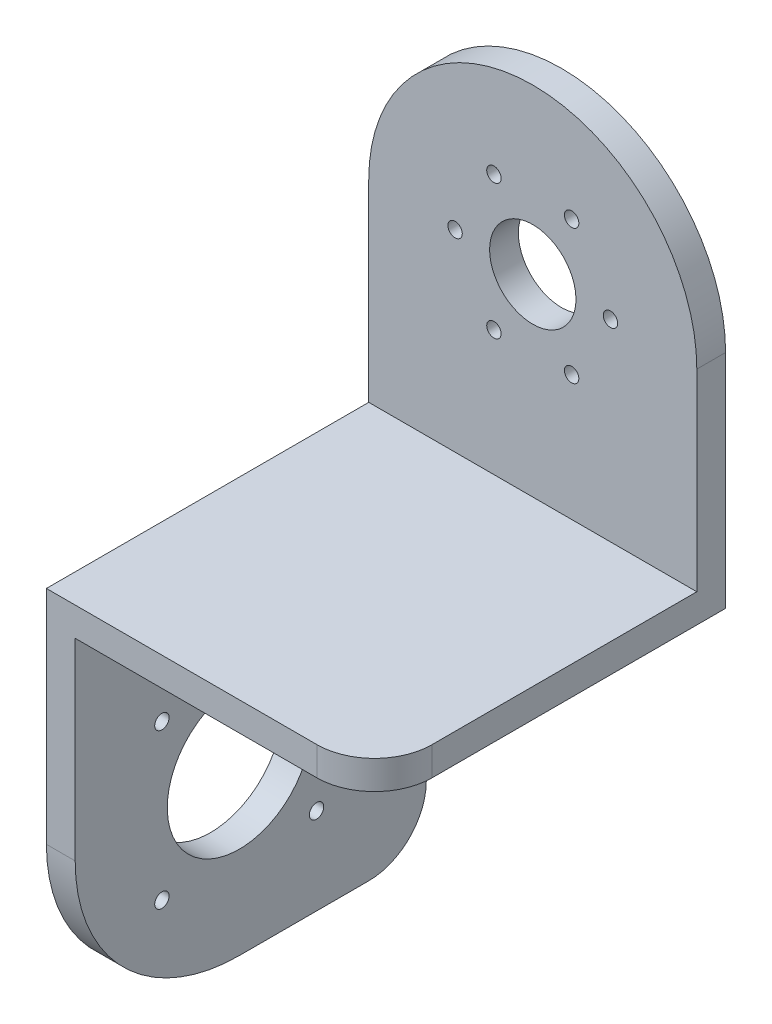
ISO-10303-21;
HEADER;
FILE_DESCRIPTION(('STEP AP214'),'2;1');
FILE_NAME('part.step','',(''),(''),'','','');
FILE_SCHEMA(('AUTOMOTIVE_DESIGN { 1 0 10303 214 1 1 1 1 }'));
ENDSEC;
DATA;
#1=APPLICATION_CONTEXT('core data for automotive mechanical design processes');
#2=APPLICATION_PROTOCOL_DEFINITION('international standard','automotive_design',2000,#1);
#3=PRODUCT_CONTEXT('',#1,'mechanical');
#4=PRODUCT('Part','Part','',(#3));
#5=PRODUCT_RELATED_PRODUCT_CATEGORY('part','',(#4));
#6=PRODUCT_DEFINITION_FORMATION('','',#4);
#7=PRODUCT_DEFINITION_CONTEXT('part definition',#1,'design');
#8=PRODUCT_DEFINITION('design','',#6,#7);
#9=PRODUCT_DEFINITION_SHAPE('','',#8);
#10=(LENGTH_UNIT() NAMED_UNIT(*) SI_UNIT(.MILLI.,.METRE.));
#11=(NAMED_UNIT(*) PLANE_ANGLE_UNIT() SI_UNIT($,.RADIAN.));
#12=(NAMED_UNIT(*) SI_UNIT($,.STERADIAN.) SOLID_ANGLE_UNIT());
#13=UNCERTAINTY_MEASURE_WITH_UNIT(LENGTH_MEASURE(1.E-05),#10,'distance_accuracy_value','');
#14=(GEOMETRIC_REPRESENTATION_CONTEXT(3) GLOBAL_UNCERTAINTY_ASSIGNED_CONTEXT((#13)) GLOBAL_UNIT_ASSIGNED_CONTEXT((#10,
#11,#12)) REPRESENTATION_CONTEXT('',''));
#15=CARTESIAN_POINT('',(0.,0.,0.));
#16=DIRECTION('',(0.,0.,1.));
#17=DIRECTION('',(1.,0.,0.));
#18=AXIS2_PLACEMENT_3D('',#15,#16,#17);
#19=CARTESIAN_POINT('',(0.,-10.1572899751787,61.));
#20=DIRECTION('',(1.,0.,0.));
#21=DIRECTION('',(0.,0.,-1.));
#22=AXIS2_PLACEMENT_3D('',#19,#20,#21);
#23=PLANE('',#22);
#24=CARTESIAN_POINT('',(0.,-25.0649711574557,19.0649711574555));
#25=DIRECTION('',(1.,0.,0.));
#26=DIRECTION('',(0.,0.,-1.));
#27=AXIS2_PLACEMENT_3D('',#24,#25,#26);
#28=CIRCLE('',#27,1.25);
#29=CARTESIAN_POINT('',(0.,-25.0649711574557,17.8149711574555));
#30=VERTEX_POINT('',#29);
#31=EDGE_CURVE('E245',#30,#30,#28,.T.);
#32=ORIENTED_EDGE('',*,*,#31,.T.);
#33=EDGE_LOOP('',(#32));
#34=FACE_BOUND('',#33,.T.);
#35=CARTESIAN_POINT('',(0.,-51.9350288425444,19.0649711574556));
#36=DIRECTION('',(1.,0.,0.));
#37=DIRECTION('',(0.,0.,-1.));
#38=AXIS2_PLACEMENT_3D('',#35,#36,#37);
#39=CIRCLE('',#38,1.25);
#40=CARTESIAN_POINT('',(0.,-51.9350288425444,17.8149711574556));
#41=VERTEX_POINT('',#40);
#42=EDGE_CURVE('E334',#41,#41,#39,.T.);
#43=ORIENTED_EDGE('',*,*,#42,.T.);
#44=EDGE_LOOP('',(#43));
#45=FACE_BOUND('',#44,.T.);
#46=CARTESIAN_POINT('',(0.,-25.0649711574557,45.9350288425445));
#47=DIRECTION('',(1.,0.,0.));
#48=DIRECTION('',(0.,0.,-1.));
#49=AXIS2_PLACEMENT_3D('',#46,#47,#48);
#50=CIRCLE('',#49,1.25);
#51=CARTESIAN_POINT('',(0.,-25.0649711574557,44.6850288425445));
#52=VERTEX_POINT('',#51);
#53=EDGE_CURVE('E389',#52,#52,#50,.T.);
#54=ORIENTED_EDGE('',*,*,#53,.T.);
#55=EDGE_LOOP('',(#54));
#56=FACE_BOUND('',#55,.T.);
#57=CARTESIAN_POINT('',(0.,-51.9350288425443,45.9350288425445));
#58=DIRECTION('',(1.,0.,0.));
#59=DIRECTION('',(0.,0.,-1.));
#60=AXIS2_PLACEMENT_3D('',#57,#58,#59);
#61=CIRCLE('',#60,1.25);
#62=CARTESIAN_POINT('',(0.,-51.9350288425443,44.6850288425445));
#63=VERTEX_POINT('',#62);
#64=EDGE_CURVE('E147',#63,#63,#61,.T.);
#65=ORIENTED_EDGE('',*,*,#64,.T.);
#66=EDGE_LOOP('',(#65));
#67=FACE_BOUND('',#66,.T.);
#68=CARTESIAN_POINT('',(0.,-38.5,32.5));
#69=DIRECTION('',(1.,0.,0.));
#70=DIRECTION('',(0.,0.,-1.));
#71=AXIS2_PLACEMENT_3D('',#68,#69,#70);
#72=CIRCLE('',#71,12.5);
#73=CARTESIAN_POINT('',(0.,-38.5,20.));
#74=VERTEX_POINT('',#73);
#75=EDGE_CURVE('E231',#74,#74,#72,.T.);
#76=ORIENTED_EDGE('',*,*,#75,.T.);
#77=EDGE_LOOP('',(#76));
#78=FACE_BOUND('',#77,.T.);
#79=DIRECTION('',(0.,-1.,0.));
#80=VECTOR('',#79,1.);
#81=CARTESIAN_POINT('',(0.,-10.1572899751787,0.));
#82=LINE('',#81,#80);
#83=CARTESIAN_POINT('',(0.,33.5,0.));
#84=VERTEX_POINT('',#83);
#85=CARTESIAN_POINT('',(0.,-57.,0.));
#86=VERTEX_POINT('',#85);
#87=EDGE_CURVE('E257',#84,#86,#82,.T.);
#88=ORIENTED_EDGE('',*,*,#87,.T.);
#89=CARTESIAN_POINT('',(0.,-57.,10.));
#90=DIRECTION('',(1.,0.,0.));
#91=DIRECTION('',(0.,0.,-1.));
#92=AXIS2_PLACEMENT_3D('',#89,#90,#91);
#93=CIRCLE('',#92,10.);
#94=CARTESIAN_POINT('',(0.,-67.,10.));
#95=VERTEX_POINT('',#94);
#96=EDGE_CURVE('E11',#86,#95,#93,.F.);
#97=ORIENTED_EDGE('',*,*,#96,.T.);
#98=DIRECTION('',(0.,0.,-1.));
#99=VECTOR('',#98,1.);
#100=CARTESIAN_POINT('',(0.,-67.,61.));
#101=LINE('',#100,#99);
#102=CARTESIAN_POINT('',(0.,-67.,32.5));
#103=VERTEX_POINT('',#102);
#104=EDGE_CURVE('E154',#103,#95,#101,.T.);
#105=ORIENTED_EDGE('',*,*,#104,.F.);
#106=CARTESIAN_POINT('',(0.,-38.5,32.5));
#107=DIRECTION('',(1.,0.,0.));
#108=DIRECTION('',(0.,0.,-1.));
#109=AXIS2_PLACEMENT_3D('',#106,#107,#108);
#110=CIRCLE('',#109,28.5);
#111=CARTESIAN_POINT('',(0.,-38.5,61.));
#112=VERTEX_POINT('',#111);
#113=EDGE_CURVE('E134',#112,#103,#110,.T.);
#114=ORIENTED_EDGE('',*,*,#113,.F.);
#115=DIRECTION('',(0.,-1.,0.));
#116=VECTOR('',#115,1.);
#117=CARTESIAN_POINT('',(0.,-10.1572899751787,61.));
#118=LINE('',#117,#116);
#119=CARTESIAN_POINT('',(0.,0.,61.));
#120=VERTEX_POINT('',#119);
#121=EDGE_CURVE('E355',#120,#112,#118,.T.);
#122=ORIENTED_EDGE('',*,*,#121,.F.);
#123=DIRECTION('',(0.,0.,-1.));
#124=VECTOR('',#123,1.);
#125=CARTESIAN_POINT('',(0.,0.,61.));
#126=LINE('',#125,#124);
#127=CARTESIAN_POINT('',(0.,0.,5.00000000000002));
#128=VERTEX_POINT('',#127);
#129=EDGE_CURVE('E328',#120,#128,#126,.T.);
#130=ORIENTED_EDGE('',*,*,#129,.T.);
#131=DIRECTION('',(0.,1.,0.));
#132=VECTOR('',#131,1.);
#133=CARTESIAN_POINT('',(0.,62.,5.));
#134=LINE('',#133,#132);
#135=CARTESIAN_POINT('',(0.,33.5,5.));
#136=VERTEX_POINT('',#135);
#137=EDGE_CURVE('E343',#128,#136,#134,.T.);
#138=ORIENTED_EDGE('',*,*,#137,.T.);
#139=DIRECTION('',(0.,0.,-1.));
#140=VECTOR('',#139,1.);
#141=CARTESIAN_POINT('',(0.,33.5,10.));
#142=LINE('',#141,#140);
#143=EDGE_CURVE('E171',#136,#84,#142,.T.);
#144=ORIENTED_EDGE('',*,*,#143,.T.);
#145=EDGE_LOOP('',(#88,#97,#105,#114,#122,#130,#138,#144));
#146=FACE_BOUND('',#145,.T.);
#147=ADVANCED_FACE('F46',(#34,#45,#56,#67,#78,#146),#23,.F.);
#148=CARTESIAN_POINT('',(0.,-67.,61.));
#149=DIRECTION('',(0.,1.,0.));
#150=DIRECTION('',(0.,0.,1.));
#151=AXIS2_PLACEMENT_3D('',#148,#149,#150);
#152=PLANE('',#151);
#153=ORIENTED_EDGE('',*,*,#104,.T.);
#154=DIRECTION('',(1.,0.,0.));
#155=VECTOR('',#154,1.);
#156=CARTESIAN_POINT('',(5.00000000000001,-67.,10.));
#157=LINE('',#156,#155);
#158=CARTESIAN_POINT('',(5.00000000000001,-67.,10.));
#159=VERTEX_POINT('',#158);
#160=EDGE_CURVE('E152',#95,#159,#157,.T.);
#161=ORIENTED_EDGE('',*,*,#160,.T.);
#162=DIRECTION('',(0.,0.,-1.));
#163=VECTOR('',#162,1.);
#164=CARTESIAN_POINT('',(5.00000000000001,-67.,61.));
#165=LINE('',#164,#163);
#166=CARTESIAN_POINT('',(5.00000000000001,-67.,32.5));
#167=VERTEX_POINT('',#166);
#168=EDGE_CURVE('E143',#167,#159,#165,.T.);
#169=ORIENTED_EDGE('',*,*,#168,.F.);
#170=DIRECTION('',(1.,0.,0.));
#171=VECTOR('',#170,1.);
#172=CARTESIAN_POINT('',(-4.99999999999999,-67.,32.5));
#173=LINE('',#172,#171);
#174=EDGE_CURVE('E128',#103,#167,#173,.T.);
#175=ORIENTED_EDGE('',*,*,#174,.F.);
#176=EDGE_LOOP('',(#153,#161,#169,#175));
#177=FACE_BOUND('',#176,.T.);
#178=ADVANCED_FACE('F150',(#177),#152,.F.);
#179=CARTESIAN_POINT('',(5.00000000000001,-67.,61.));
#180=DIRECTION('',(-1.,0.,0.));
#181=DIRECTION('',(0.,-1.,0.));
#182=AXIS2_PLACEMENT_3D('',#179,#180,#181);
#183=PLANE('',#182);
#184=CARTESIAN_POINT('',(5.00000000000001,-25.0649711574557,19.0649711574555));
#185=DIRECTION('',(1.,0.,0.));
#186=DIRECTION('',(0.,-1.,0.));
#187=AXIS2_PLACEMENT_3D('',#184,#185,#186);
#188=CIRCLE('',#187,1.25);
#189=CARTESIAN_POINT('',(5.00000000000001,-26.3149711574557,19.0649711574555));
#190=VERTEX_POINT('',#189);
#191=EDGE_CURVE('E305',#190,#190,#188,.T.);
#192=ORIENTED_EDGE('',*,*,#191,.F.);
#193=EDGE_LOOP('',(#192));
#194=FACE_BOUND('',#193,.T.);
#195=CARTESIAN_POINT('',(5.00000000000001,-51.9350288425444,19.0649711574556));
#196=DIRECTION('',(1.,0.,0.));
#197=DIRECTION('',(0.,0.,1.));
#198=AXIS2_PLACEMENT_3D('',#195,#196,#197);
#199=CIRCLE('',#198,1.25);
#200=CARTESIAN_POINT('',(5.00000000000001,-51.9350288425444,20.3149711574556));
#201=VERTEX_POINT('',#200);
#202=EDGE_CURVE('E314',#201,#201,#199,.T.);
#203=ORIENTED_EDGE('',*,*,#202,.F.);
#204=EDGE_LOOP('',(#203));
#205=FACE_BOUND('',#204,.T.);
#206=CARTESIAN_POINT('',(5.00000000000001,-25.0649711574557,45.9350288425445));
#207=DIRECTION('',(1.,0.,0.));
#208=DIRECTION('',(0.,0.,-1.));
#209=AXIS2_PLACEMENT_3D('',#206,#207,#208);
#210=CIRCLE('',#209,1.25);
#211=CARTESIAN_POINT('',(5.00000000000001,-25.0649711574557,44.6850288425445));
#212=VERTEX_POINT('',#211);
#213=EDGE_CURVE('E302',#212,#212,#210,.T.);
#214=ORIENTED_EDGE('',*,*,#213,.F.);
#215=EDGE_LOOP('',(#214));
#216=FACE_BOUND('',#215,.T.);
#217=CARTESIAN_POINT('',(5.00000000000001,-51.9350288425443,45.9350288425445));
#218=DIRECTION('',(1.,0.,0.));
#219=DIRECTION('',(0.,1.,0.));
#220=AXIS2_PLACEMENT_3D('',#217,#218,#219);
#221=CIRCLE('',#220,1.25);
#222=CARTESIAN_POINT('',(5.00000000000001,-50.6850288425443,45.9350288425445));
#223=VERTEX_POINT('',#222);
#224=EDGE_CURVE('E240',#223,#223,#221,.T.);
#225=ORIENTED_EDGE('',*,*,#224,.F.);
#226=EDGE_LOOP('',(#225));
#227=FACE_BOUND('',#226,.T.);
#228=CARTESIAN_POINT('',(5.00000000000001,-38.5,32.5));
#229=DIRECTION('',(1.,0.,0.));
#230=DIRECTION('',(0.,1.,0.));
#231=AXIS2_PLACEMENT_3D('',#228,#229,#230);
#232=CIRCLE('',#231,12.5);
#233=CARTESIAN_POINT('',(5.00000000000001,-26.,32.5));
#234=VERTEX_POINT('',#233);
#235=EDGE_CURVE('E244',#234,#234,#232,.T.);
#236=ORIENTED_EDGE('',*,*,#235,.F.);
#237=EDGE_LOOP('',(#236));
#238=FACE_BOUND('',#237,.T.);
#239=ORIENTED_EDGE('',*,*,#168,.T.);
#240=CARTESIAN_POINT('',(5.00000000000001,-57.,10.));
#241=DIRECTION('',(-1.,0.,0.));
#242=DIRECTION('',(0.,-1.,0.));
#243=AXIS2_PLACEMENT_3D('',#240,#241,#242);
#244=CIRCLE('',#243,10.);
#245=CARTESIAN_POINT('',(5.00000000000001,-57.,0.));
#246=VERTEX_POINT('',#245);
#247=EDGE_CURVE('E69',#159,#246,#244,.F.);
#248=ORIENTED_EDGE('',*,*,#247,.T.);
#249=DIRECTION('',(0.,1.,0.));
#250=VECTOR('',#249,1.);
#251=CARTESIAN_POINT('',(5.00000000000001,-67.,0.));
#252=LINE('',#251,#250);
#253=CARTESIAN_POINT('',(5.,-5.00000000000001,0.));
#254=VERTEX_POINT('',#253);
#255=EDGE_CURVE('E360',#246,#254,#252,.T.);
#256=ORIENTED_EDGE('',*,*,#255,.T.);
#257=DIRECTION('',(0.,0.,-1.));
#258=VECTOR('',#257,1.);
#259=CARTESIAN_POINT('',(5.,-5.00000000000001,61.));
#260=LINE('',#259,#258);
#261=CARTESIAN_POINT('',(5.,-5.00000000000001,61.));
#262=VERTEX_POINT('',#261);
#263=EDGE_CURVE('E155',#262,#254,#260,.T.);
#264=ORIENTED_EDGE('',*,*,#263,.F.);
#265=DIRECTION('',(0.,1.,0.));
#266=VECTOR('',#265,1.);
#267=CARTESIAN_POINT('',(5.00000000000001,-67.,61.));
#268=LINE('',#267,#266);
#269=CARTESIAN_POINT('',(5.00000000000001,-38.5,61.));
#270=VERTEX_POINT('',#269);
#271=EDGE_CURVE('E145',#270,#262,#268,.T.);
#272=ORIENTED_EDGE('',*,*,#271,.F.);
#273=CARTESIAN_POINT('',(5.00000000000001,-38.5,32.5));
#274=DIRECTION('',(1.,0.,0.));
#275=DIRECTION('',(0.,1.,0.));
#276=AXIS2_PLACEMENT_3D('',#273,#274,#275);
#277=CIRCLE('',#276,28.5);
#278=EDGE_CURVE('E131',#270,#167,#277,.T.);
#279=ORIENTED_EDGE('',*,*,#278,.T.);
#280=EDGE_LOOP('',(#239,#248,#256,#264,#272,#279));
#281=FACE_BOUND('',#280,.T.);
#282=ADVANCED_FACE('F142',(#194,#205,#216,#227,#238,#281),#183,.F.);
#283=CARTESIAN_POINT('',(0.,0.,0.));
#284=DIRECTION('',(0.,0.,-1.));
#285=DIRECTION('',(-1.,0.,0.));
#286=AXIS2_PLACEMENT_3D('',#283,#284,#285);
#287=PLANE('',#286);
#288=CARTESIAN_POINT('',(42.,33.5,0.));
#289=DIRECTION('',(0.,0.,-1.));
#290=DIRECTION('',(1.,0.,0.));
#291=AXIS2_PLACEMENT_3D('',#288,#289,#290);
#292=CIRCLE('',#291,1.25);
#293=CARTESIAN_POINT('',(43.25,33.5,0.));
#294=VERTEX_POINT('',#293);
#295=EDGE_CURVE('E290',#294,#294,#292,.T.);
#296=ORIENTED_EDGE('',*,*,#295,.F.);
#297=EDGE_LOOP('',(#296));
#298=FACE_BOUND('',#297,.T.);
#299=CARTESIAN_POINT('',(35.2499999999999,21.80865704891,0.));
#300=DIRECTION('',(0.,0.,-1.));
#301=DIRECTION('',(0.499999999999992,-0.866025403784443,0.));
#302=AXIS2_PLACEMENT_3D('',#299,#300,#301);
#303=CIRCLE('',#302,1.25);
#304=CARTESIAN_POINT('',(35.8749999999999,20.7261252941795,0.));
#305=VERTEX_POINT('',#304);
#306=EDGE_CURVE('E284',#305,#305,#303,.T.);
#307=ORIENTED_EDGE('',*,*,#306,.F.);
#308=EDGE_LOOP('',(#307));
#309=FACE_BOUND('',#308,.T.);
#310=CARTESIAN_POINT('',(21.75,45.1913429510899,0.));
#311=DIRECTION('',(0.,0.,-1.));
#312=DIRECTION('',(-0.499999999999998,0.86602540378444,0.));
#313=AXIS2_PLACEMENT_3D('',#310,#311,#312);
#314=CIRCLE('',#313,1.25);
#315=CARTESIAN_POINT('',(21.125,46.2738747058205,0.));
#316=VERTEX_POINT('',#315);
#317=EDGE_CURVE('E191',#316,#316,#314,.T.);
#318=ORIENTED_EDGE('',*,*,#317,.F.);
#319=EDGE_LOOP('',(#318));
#320=FACE_BOUND('',#319,.T.);
#321=CARTESIAN_POINT('',(35.2500000000001,45.1913429510899,0.));
#322=DIRECTION('',(0.,0.,-1.));
#323=DIRECTION('',(0.500000000000004,0.866025403784436,0.));
#324=AXIS2_PLACEMENT_3D('',#321,#322,#323);
#325=CIRCLE('',#324,1.25);
#326=CARTESIAN_POINT('',(35.8750000000001,46.2738747058204,0.));
#327=VERTEX_POINT('',#326);
#328=EDGE_CURVE('E271',#327,#327,#325,.T.);
#329=ORIENTED_EDGE('',*,*,#328,.F.);
#330=EDGE_LOOP('',(#329));
#331=FACE_BOUND('',#330,.T.);
#332=CARTESIAN_POINT('',(21.7499999999999,21.8086570489102,0.));
#333=DIRECTION('',(0.,0.,-1.));
#334=DIRECTION('',(-0.50000000000001,-0.866025403784433,0.));
#335=AXIS2_PLACEMENT_3D('',#332,#333,#334);
#336=CIRCLE('',#335,1.25);
#337=CARTESIAN_POINT('',(21.1249999999999,20.7261252941796,0.));
#338=VERTEX_POINT('',#337);
#339=EDGE_CURVE('E251',#338,#338,#336,.T.);
#340=ORIENTED_EDGE('',*,*,#339,.F.);
#341=EDGE_LOOP('',(#340));
#342=FACE_BOUND('',#341,.T.);
#343=CARTESIAN_POINT('',(28.5,33.4999999999999,0.));
#344=DIRECTION('',(0.,0.,-1.));
#345=DIRECTION('',(-1.,0.,0.));
#346=AXIS2_PLACEMENT_3D('',#343,#344,#345);
#347=CIRCLE('',#346,7.5);
#348=CARTESIAN_POINT('',(21.,33.4999999999999,0.));
#349=VERTEX_POINT('',#348);
#350=EDGE_CURVE('E181',#349,#349,#347,.T.);
#351=ORIENTED_EDGE('',*,*,#350,.F.);
#352=EDGE_LOOP('',(#351));
#353=FACE_BOUND('',#352,.T.);
#354=CARTESIAN_POINT('',(15.,33.5,0.));
#355=DIRECTION('',(0.,0.,-1.));
#356=DIRECTION('',(-1.,0.,0.));
#357=AXIS2_PLACEMENT_3D('',#354,#355,#356);
#358=CIRCLE('',#357,1.25);
#359=CARTESIAN_POINT('',(13.75,33.5,0.));
#360=VERTEX_POINT('',#359);
#361=EDGE_CURVE('E207',#360,#360,#358,.T.);
#362=ORIENTED_EDGE('',*,*,#361,.F.);
#363=EDGE_LOOP('',(#362));
#364=FACE_BOUND('',#363,.T.);
#365=ORIENTED_EDGE('',*,*,#255,.F.);
#366=DIRECTION('',(1.,0.,0.));
#367=VECTOR('',#366,1.);
#368=CARTESIAN_POINT('',(0.,-57.,0.));
#369=LINE('',#368,#367);
#370=EDGE_CURVE('E55',#246,#86,#369,.F.);
#371=ORIENTED_EDGE('',*,*,#370,.T.);
#372=ORIENTED_EDGE('',*,*,#87,.F.);
#373=CARTESIAN_POINT('',(28.5,33.5,0.));
#374=DIRECTION('',(0.,0.,-1.));
#375=DIRECTION('',(-1.,0.,0.));
#376=AXIS2_PLACEMENT_3D('',#373,#374,#375);
#377=CIRCLE('',#376,28.5);
#378=CARTESIAN_POINT('',(57.,33.5,0.));
#379=VERTEX_POINT('',#378);
#380=EDGE_CURVE('E185',#84,#379,#377,.T.);
#381=ORIENTED_EDGE('',*,*,#380,.T.);
#382=DIRECTION('',(0.,1.,0.));
#383=VECTOR('',#382,1.);
#384=CARTESIAN_POINT('',(57.,0.,0.));
#385=LINE('',#384,#383);
#386=CARTESIAN_POINT('',(57.,-5.,0.));
#387=VERTEX_POINT('',#386);
#388=EDGE_CURVE('E351',#387,#379,#385,.T.);
#389=ORIENTED_EDGE('',*,*,#388,.F.);
#390=DIRECTION('',(1.,0.,0.));
#391=VECTOR('',#390,1.);
#392=CARTESIAN_POINT('',(57.,-5.,0.));
#393=LINE('',#392,#391);
#394=EDGE_CURVE('E356',#254,#387,#393,.T.);
#395=ORIENTED_EDGE('',*,*,#394,.F.);
#396=EDGE_LOOP('',(#365,#371,#372,#381,#389,#395));
#397=FACE_BOUND('',#396,.T.);
#398=ADVANCED_FACE('F401',(#298,#309,#320,#331,#342,#353,#364,#397),#287,.T.);
#399=CARTESIAN_POINT('',(57.,62.,5.));
#400=DIRECTION('',(0.,0.,1.));
#401=DIRECTION('',(0.,-1.,0.));
#402=AXIS2_PLACEMENT_3D('',#399,#400,#401);
#403=PLANE('',#402);
#404=CARTESIAN_POINT('',(42.,33.5,5.));
#405=DIRECTION('',(0.,0.,1.));
#406=DIRECTION('',(0.,-1.,0.));
#407=AXIS2_PLACEMENT_3D('',#404,#405,#406);
#408=CIRCLE('',#407,1.25);
#409=CARTESIAN_POINT('',(42.,32.25,5.));
#410=VERTEX_POINT('',#409);
#411=EDGE_CURVE('E203',#410,#410,#408,.T.);
#412=ORIENTED_EDGE('',*,*,#411,.F.);
#413=EDGE_LOOP('',(#412));
#414=FACE_BOUND('',#413,.T.);
#415=CARTESIAN_POINT('',(35.2499999999999,21.80865704891,5.));
#416=DIRECTION('',(0.,0.,1.));
#417=DIRECTION('',(0.,-1.,0.));
#418=AXIS2_PLACEMENT_3D('',#415,#416,#417);
#419=CIRCLE('',#418,1.25);
#420=CARTESIAN_POINT('',(35.2499999999999,20.55865704891,5.));
#421=VERTEX_POINT('',#420);
#422=EDGE_CURVE('E199',#421,#421,#419,.T.);
#423=ORIENTED_EDGE('',*,*,#422,.F.);
#424=EDGE_LOOP('',(#423));
#425=FACE_BOUND('',#424,.T.);
#426=CARTESIAN_POINT('',(21.75,45.1913429510899,5.));
#427=DIRECTION('',(0.,0.,1.));
#428=DIRECTION('',(0.,-1.,0.));
#429=AXIS2_PLACEMENT_3D('',#426,#427,#428);
#430=CIRCLE('',#429,1.25);
#431=CARTESIAN_POINT('',(21.75,43.9413429510899,5.));
#432=VERTEX_POINT('',#431);
#433=EDGE_CURVE('E195',#432,#432,#430,.T.);
#434=ORIENTED_EDGE('',*,*,#433,.F.);
#435=EDGE_LOOP('',(#434));
#436=FACE_BOUND('',#435,.T.);
#437=CARTESIAN_POINT('',(35.2500000000001,45.1913429510899,5.));
#438=DIRECTION('',(0.,0.,1.));
#439=DIRECTION('',(0.,-1.,0.));
#440=AXIS2_PLACEMENT_3D('',#437,#438,#439);
#441=CIRCLE('',#440,1.25);
#442=CARTESIAN_POINT('',(35.2500000000001,43.9413429510899,5.));
#443=VERTEX_POINT('',#442);
#444=EDGE_CURVE('E190',#443,#443,#441,.T.);
#445=ORIENTED_EDGE('',*,*,#444,.F.);
#446=EDGE_LOOP('',(#445));
#447=FACE_BOUND('',#446,.T.);
#448=CARTESIAN_POINT('',(21.7499999999999,21.8086570489102,5.));
#449=DIRECTION('',(0.,0.,1.));
#450=DIRECTION('',(0.,-1.,0.));
#451=AXIS2_PLACEMENT_3D('',#448,#449,#450);
#452=CIRCLE('',#451,1.25);
#453=CARTESIAN_POINT('',(21.7499999999999,20.5586570489102,5.));
#454=VERTEX_POINT('',#453);
#455=EDGE_CURVE('E186',#454,#454,#452,.T.);
#456=ORIENTED_EDGE('',*,*,#455,.F.);
#457=EDGE_LOOP('',(#456));
#458=FACE_BOUND('',#457,.T.);
#459=CARTESIAN_POINT('',(28.5,33.4999999999999,5.));
#460=DIRECTION('',(0.,0.,1.));
#461=DIRECTION('',(0.,-1.,0.));
#462=AXIS2_PLACEMENT_3D('',#459,#460,#461);
#463=CIRCLE('',#462,7.5);
#464=CARTESIAN_POINT('',(28.5,25.9999999999999,5.));
#465=VERTEX_POINT('',#464);
#466=EDGE_CURVE('E180',#465,#465,#463,.T.);
#467=ORIENTED_EDGE('',*,*,#466,.F.);
#468=EDGE_LOOP('',(#467));
#469=FACE_BOUND('',#468,.T.);
#470=CARTESIAN_POINT('',(15.,33.5,5.));
#471=DIRECTION('',(0.,0.,1.));
#472=DIRECTION('',(0.,-1.,0.));
#473=AXIS2_PLACEMENT_3D('',#470,#471,#472);
#474=CIRCLE('',#473,1.25);
#475=CARTESIAN_POINT('',(15.,32.25,5.));
#476=VERTEX_POINT('',#475);
#477=EDGE_CURVE('E176',#476,#476,#474,.T.);
#478=ORIENTED_EDGE('',*,*,#477,.F.);
#479=EDGE_LOOP('',(#478));
#480=FACE_BOUND('',#479,.T.);
#481=CARTESIAN_POINT('',(28.5,33.5,5.));
#482=DIRECTION('',(0.,0.,1.));
#483=DIRECTION('',(0.,-1.,0.));
#484=AXIS2_PLACEMENT_3D('',#481,#482,#483);
#485=CIRCLE('',#484,28.5);
#486=CARTESIAN_POINT('',(57.,33.5,5.));
#487=VERTEX_POINT('',#486);
#488=EDGE_CURVE('E161',#487,#136,#485,.T.);
#489=ORIENTED_EDGE('',*,*,#488,.T.);
#490=ORIENTED_EDGE('',*,*,#137,.F.);
#491=DIRECTION('',(-1.,0.,0.));
#492=VECTOR('',#491,1.);
#493=CARTESIAN_POINT('',(57.,0.,5.));
#494=LINE('',#493,#492);
#495=CARTESIAN_POINT('',(57.,0.,5.));
#496=VERTEX_POINT('',#495);
#497=EDGE_CURVE('E254',#496,#128,#494,.T.);
#498=ORIENTED_EDGE('',*,*,#497,.F.);
#499=DIRECTION('',(0.,1.,0.));
#500=VECTOR('',#499,1.);
#501=CARTESIAN_POINT('',(57.,62.,5.));
#502=LINE('',#501,#500);
#503=EDGE_CURVE('E258',#496,#487,#502,.T.);
#504=ORIENTED_EDGE('',*,*,#503,.T.);
#505=EDGE_LOOP('',(#489,#490,#498,#504));
#506=FACE_BOUND('',#505,.T.);
#507=ADVANCED_FACE('F447',(#414,#425,#436,#447,#458,#469,#480,#506),#403,.T.);
#508=CARTESIAN_POINT('',(57.,0.,61.));
#509=DIRECTION('',(-1.,0.,0.));
#510=DIRECTION('',(0.,0.,1.));
#511=AXIS2_PLACEMENT_3D('',#508,#509,#510);
#512=PLANE('',#511);
#513=DIRECTION('',(0.,0.,-1.));
#514=VECTOR('',#513,1.);
#515=CARTESIAN_POINT('',(57.,0.,61.));
#516=LINE('',#515,#514);
#517=CARTESIAN_POINT('',(57.,0.,51.));
#518=VERTEX_POINT('',#517);
#519=EDGE_CURVE('E323',#518,#496,#516,.T.);
#520=ORIENTED_EDGE('',*,*,#519,.F.);
#521=DIRECTION('',(0.,1.,0.));
#522=VECTOR('',#521,1.);
#523=CARTESIAN_POINT('',(57.,0.,51.));
#524=LINE('',#523,#522);
#525=CARTESIAN_POINT('',(57.,-5.,51.));
#526=VERTEX_POINT('',#525);
#527=EDGE_CURVE('E217',#518,#526,#524,.F.);
#528=ORIENTED_EDGE('',*,*,#527,.T.);
#529=DIRECTION('',(0.,0.,-1.));
#530=VECTOR('',#529,1.);
#531=CARTESIAN_POINT('',(57.,-5.,61.));
#532=LINE('',#531,#530);
#533=EDGE_CURVE('E165',#526,#387,#532,.T.);
#534=ORIENTED_EDGE('',*,*,#533,.T.);
#535=ORIENTED_EDGE('',*,*,#388,.T.);
#536=DIRECTION('',(0.,0.,-1.));
#537=VECTOR('',#536,1.);
#538=CARTESIAN_POINT('',(57.,33.5,10.));
#539=LINE('',#538,#537);
#540=EDGE_CURVE('E374',#487,#379,#539,.T.);
#541=ORIENTED_EDGE('',*,*,#540,.F.);
#542=ORIENTED_EDGE('',*,*,#503,.F.);
#543=EDGE_LOOP('',(#520,#528,#534,#535,#541,#542));
#544=FACE_BOUND('',#543,.T.);
#545=ADVANCED_FACE('F443',(#544),#512,.F.);
#546=CARTESIAN_POINT('',(57.,-5.,61.));
#547=DIRECTION('',(0.,1.,0.));
#548=DIRECTION('',(-1.,0.,0.));
#549=AXIS2_PLACEMENT_3D('',#546,#547,#548);
#550=PLANE('',#549);
#551=ORIENTED_EDGE('',*,*,#533,.F.);
#552=CARTESIAN_POINT('',(47.,-5.,51.));
#553=DIRECTION('',(0.,1.,0.));
#554=DIRECTION('',(-1.,0.,0.));
#555=AXIS2_PLACEMENT_3D('',#552,#553,#554);
#556=CIRCLE('',#555,10.);
#557=CARTESIAN_POINT('',(47.,-5.,61.));
#558=VERTEX_POINT('',#557);
#559=EDGE_CURVE('E220',#526,#558,#556,.F.);
#560=ORIENTED_EDGE('',*,*,#559,.T.);
#561=DIRECTION('',(1.,0.,0.));
#562=VECTOR('',#561,1.);
#563=CARTESIAN_POINT('',(57.,-5.,61.));
#564=LINE('',#563,#562);
#565=EDGE_CURVE('E329',#262,#558,#564,.T.);
#566=ORIENTED_EDGE('',*,*,#565,.F.);
#567=ORIENTED_EDGE('',*,*,#263,.T.);
#568=ORIENTED_EDGE('',*,*,#394,.T.);
#569=EDGE_LOOP('',(#551,#560,#566,#567,#568));
#570=FACE_BOUND('',#569,.T.);
#571=ADVANCED_FACE('F439',(#570),#550,.F.);
#572=CARTESIAN_POINT('',(0.,0.,61.));
#573=DIRECTION('',(0.,-1.,0.));
#574=DIRECTION('',(0.,0.,-1.));
#575=AXIS2_PLACEMENT_3D('',#572,#573,#574);
#576=PLANE('',#575);
#577=DIRECTION('',(-1.,0.,0.));
#578=VECTOR('',#577,1.);
#579=CARTESIAN_POINT('',(0.,0.,61.));
#580=LINE('',#579,#578);
#581=CARTESIAN_POINT('',(47.,0.,61.));
#582=VERTEX_POINT('',#581);
#583=EDGE_CURVE('E325',#582,#120,#580,.T.);
#584=ORIENTED_EDGE('',*,*,#583,.F.);
#585=CARTESIAN_POINT('',(47.,0.,51.));
#586=DIRECTION('',(0.,-1.,0.));
#587=DIRECTION('',(0.,0.,-1.));
#588=AXIS2_PLACEMENT_3D('',#585,#586,#587);
#589=CIRCLE('',#588,10.);
#590=EDGE_CURVE('E214',#582,#518,#589,.F.);
#591=ORIENTED_EDGE('',*,*,#590,.T.);
#592=ORIENTED_EDGE('',*,*,#519,.T.);
#593=ORIENTED_EDGE('',*,*,#497,.T.);
#594=ORIENTED_EDGE('',*,*,#129,.F.);
#595=EDGE_LOOP('',(#584,#591,#592,#593,#594));
#596=FACE_BOUND('',#595,.T.);
#597=ADVANCED_FACE('F442',(#596),#576,.F.);
#598=CARTESIAN_POINT('',(0.,0.,61.));
#599=DIRECTION('',(0.,0.,-1.));
#600=DIRECTION('',(-1.,0.,0.));
#601=AXIS2_PLACEMENT_3D('',#598,#599,#600);
#602=PLANE('',#601);
#603=ORIENTED_EDGE('',*,*,#565,.T.);
#604=DIRECTION('',(0.,1.,0.));
#605=VECTOR('',#604,1.);
#606=CARTESIAN_POINT('',(47.,0.,61.));
#607=LINE('',#606,#605);
#608=EDGE_CURVE('E210',#558,#582,#607,.T.);
#609=ORIENTED_EDGE('',*,*,#608,.T.);
#610=ORIENTED_EDGE('',*,*,#583,.T.);
#611=ORIENTED_EDGE('',*,*,#121,.T.);
#612=DIRECTION('',(1.,0.,0.));
#613=VECTOR('',#612,1.);
#614=CARTESIAN_POINT('',(-4.99999999999999,-38.5,61.));
#615=LINE('',#614,#613);
#616=EDGE_CURVE('E175',#112,#270,#615,.T.);
#617=ORIENTED_EDGE('',*,*,#616,.T.);
#618=ORIENTED_EDGE('',*,*,#271,.T.);
#619=EDGE_LOOP('',(#603,#609,#610,#611,#617,#618));
#620=FACE_BOUND('',#619,.T.);
#621=ADVANCED_FACE('F451',(#620),#602,.F.);
#622=CARTESIAN_POINT('',(28.5,33.5,10.));
#623=DIRECTION('',(0.,0.,-1.));
#624=DIRECTION('',(-1.,0.,0.));
#625=AXIS2_PLACEMENT_3D('',#622,#623,#624);
#626=CYLINDRICAL_SURFACE('',#625,28.5);
#627=ORIENTED_EDGE('',*,*,#540,.T.);
#628=ORIENTED_EDGE('',*,*,#380,.F.);
#629=ORIENTED_EDGE('',*,*,#143,.F.);
#630=ORIENTED_EDGE('',*,*,#488,.F.);
#631=EDGE_LOOP('',(#627,#628,#629,#630));
#632=FACE_BOUND('',#631,.T.);
#633=ADVANCED_FACE('F457',(#632),#626,.T.);
#634=CARTESIAN_POINT('',(15.,33.5,10.));
#635=DIRECTION('',(0.,0.,-1.));
#636=DIRECTION('',(-1.,0.,0.));
#637=AXIS2_PLACEMENT_3D('',#634,#635,#636);
#638=CYLINDRICAL_SURFACE('',#637,1.25);
#639=ORIENTED_EDGE('',*,*,#477,.T.);
#640=EDGE_LOOP('',(#639));
#641=FACE_BOUND('',#640,.T.);
#642=ORIENTED_EDGE('',*,*,#361,.T.);
#643=EDGE_LOOP('',(#642));
#644=FACE_BOUND('',#643,.T.);
#645=ADVANCED_FACE('F464',(#641,#644),#638,.F.);
#646=CARTESIAN_POINT('',(28.5,33.4999999999999,10.));
#647=DIRECTION('',(0.,0.,-1.));
#648=DIRECTION('',(-1.,0.,0.));
#649=AXIS2_PLACEMENT_3D('',#646,#647,#648);
#650=CYLINDRICAL_SURFACE('',#649,7.5);
#651=ORIENTED_EDGE('',*,*,#466,.T.);
#652=EDGE_LOOP('',(#651));
#653=FACE_BOUND('',#652,.T.);
#654=ORIENTED_EDGE('',*,*,#350,.T.);
#655=EDGE_LOOP('',(#654));
#656=FACE_BOUND('',#655,.T.);
#657=ADVANCED_FACE('F468',(#653,#656),#650,.F.);
#658=CARTESIAN_POINT('',(21.7499999999999,21.8086570489102,10.));
#659=DIRECTION('',(0.,0.,-1.));
#660=DIRECTION('',(-1.,0.,0.));
#661=AXIS2_PLACEMENT_3D('',#658,#659,#660);
#662=CYLINDRICAL_SURFACE('',#661,1.25);
#663=ORIENTED_EDGE('',*,*,#455,.T.);
#664=EDGE_LOOP('',(#663));
#665=FACE_BOUND('',#664,.T.);
#666=ORIENTED_EDGE('',*,*,#339,.T.);
#667=EDGE_LOOP('',(#666));
#668=FACE_BOUND('',#667,.T.);
#669=ADVANCED_FACE('F472',(#665,#668),#662,.F.);
#670=CARTESIAN_POINT('',(35.2500000000001,45.1913429510899,10.));
#671=DIRECTION('',(0.,0.,-1.));
#672=DIRECTION('',(-1.,0.,0.));
#673=AXIS2_PLACEMENT_3D('',#670,#671,#672);
#674=CYLINDRICAL_SURFACE('',#673,1.25);
#675=ORIENTED_EDGE('',*,*,#444,.T.);
#676=EDGE_LOOP('',(#675));
#677=FACE_BOUND('',#676,.T.);
#678=ORIENTED_EDGE('',*,*,#328,.T.);
#679=EDGE_LOOP('',(#678));
#680=FACE_BOUND('',#679,.T.);
#681=ADVANCED_FACE('F478',(#677,#680),#674,.F.);
#682=CARTESIAN_POINT('',(21.75,45.1913429510899,10.));
#683=DIRECTION('',(0.,0.,-1.));
#684=DIRECTION('',(-1.,0.,0.));
#685=AXIS2_PLACEMENT_3D('',#682,#683,#684);
#686=CYLINDRICAL_SURFACE('',#685,1.25);
#687=ORIENTED_EDGE('',*,*,#433,.T.);
#688=EDGE_LOOP('',(#687));
#689=FACE_BOUND('',#688,.T.);
#690=ORIENTED_EDGE('',*,*,#317,.T.);
#691=EDGE_LOOP('',(#690));
#692=FACE_BOUND('',#691,.T.);
#693=ADVANCED_FACE('F474',(#689,#692),#686,.F.);
#694=CARTESIAN_POINT('',(35.2499999999999,21.80865704891,10.));
#695=DIRECTION('',(0.,0.,-1.));
#696=DIRECTION('',(-1.,0.,0.));
#697=AXIS2_PLACEMENT_3D('',#694,#695,#696);
#698=CYLINDRICAL_SURFACE('',#697,1.25);
#699=ORIENTED_EDGE('',*,*,#422,.T.);
#700=EDGE_LOOP('',(#699));
#701=FACE_BOUND('',#700,.T.);
#702=ORIENTED_EDGE('',*,*,#306,.T.);
#703=EDGE_LOOP('',(#702));
#704=FACE_BOUND('',#703,.T.);
#705=ADVANCED_FACE('F477',(#701,#704),#698,.F.);
#706=CARTESIAN_POINT('',(42.,33.5,10.));
#707=DIRECTION('',(0.,0.,-1.));
#708=DIRECTION('',(-1.,0.,0.));
#709=AXIS2_PLACEMENT_3D('',#706,#707,#708);
#710=CYLINDRICAL_SURFACE('',#709,1.25);
#711=ORIENTED_EDGE('',*,*,#411,.T.);
#712=EDGE_LOOP('',(#711));
#713=FACE_BOUND('',#712,.T.);
#714=ORIENTED_EDGE('',*,*,#295,.T.);
#715=EDGE_LOOP('',(#714));
#716=FACE_BOUND('',#715,.T.);
#717=ADVANCED_FACE('F433',(#713,#716),#710,.F.);
#718=CARTESIAN_POINT('',(-4.99999999999999,-38.5,32.5));
#719=DIRECTION('',(1.,0.,0.));
#720=DIRECTION('',(0.,1.,0.));
#721=AXIS2_PLACEMENT_3D('',#718,#719,#720);
#722=CYLINDRICAL_SURFACE('',#721,28.5);
#723=ORIENTED_EDGE('',*,*,#113,.T.);
#724=ORIENTED_EDGE('',*,*,#174,.T.);
#725=ORIENTED_EDGE('',*,*,#278,.F.);
#726=ORIENTED_EDGE('',*,*,#616,.F.);
#727=EDGE_LOOP('',(#723,#724,#725,#726));
#728=FACE_BOUND('',#727,.T.);
#729=ADVANCED_FACE('F130',(#728),#722,.T.);
#730=CARTESIAN_POINT('',(47.,0.,51.));
#731=DIRECTION('',(0.,1.,0.));
#732=DIRECTION('',(0.,0.,1.));
#733=AXIS2_PLACEMENT_3D('',#730,#731,#732);
#734=CYLINDRICAL_SURFACE('',#733,10.);
#735=ORIENTED_EDGE('',*,*,#559,.F.);
#736=ORIENTED_EDGE('',*,*,#527,.F.);
#737=ORIENTED_EDGE('',*,*,#590,.F.);
#738=ORIENTED_EDGE('',*,*,#608,.F.);
#739=EDGE_LOOP('',(#735,#736,#737,#738));
#740=FACE_BOUND('',#739,.T.);
#741=ADVANCED_FACE('F425',(#740),#734,.T.);
#742=CARTESIAN_POINT('',(0.,-57.,10.));
#743=DIRECTION('',(-1.,0.,0.));
#744=DIRECTION('',(0.,0.,1.));
#745=AXIS2_PLACEMENT_3D('',#742,#743,#744);
#746=CYLINDRICAL_SURFACE('',#745,10.);
#747=ORIENTED_EDGE('',*,*,#96,.F.);
#748=ORIENTED_EDGE('',*,*,#370,.F.);
#749=ORIENTED_EDGE('',*,*,#247,.F.);
#750=ORIENTED_EDGE('',*,*,#160,.F.);
#751=EDGE_LOOP('',(#747,#748,#749,#750));
#752=FACE_BOUND('',#751,.T.);
#753=ADVANCED_FACE('F48',(#752),#746,.T.);
#754=CARTESIAN_POINT('',(-4.99999999999999,-38.5,32.5));
#755=DIRECTION('',(1.,0.,0.));
#756=DIRECTION('',(0.,1.,0.));
#757=AXIS2_PLACEMENT_3D('',#754,#755,#756);
#758=CYLINDRICAL_SURFACE('',#757,12.5);
#759=ORIENTED_EDGE('',*,*,#235,.T.);
#760=EDGE_LOOP('',(#759));
#761=FACE_BOUND('',#760,.T.);
#762=ORIENTED_EDGE('',*,*,#75,.F.);
#763=EDGE_LOOP('',(#762));
#764=FACE_BOUND('',#763,.T.);
#765=ADVANCED_FACE('F410',(#761,#764),#758,.F.);
#766=CARTESIAN_POINT('',(-4.99999999999999,-51.9350288425443,45.9350288425445));
#767=DIRECTION('',(1.,0.,0.));
#768=DIRECTION('',(0.,1.,0.));
#769=AXIS2_PLACEMENT_3D('',#766,#767,#768);
#770=CYLINDRICAL_SURFACE('',#769,1.25);
#771=ORIENTED_EDGE('',*,*,#224,.T.);
#772=EDGE_LOOP('',(#771));
#773=FACE_BOUND('',#772,.T.);
#774=ORIENTED_EDGE('',*,*,#64,.F.);
#775=EDGE_LOOP('',(#774));
#776=FACE_BOUND('',#775,.T.);
#777=ADVANCED_FACE('F413',(#773,#776),#770,.F.);
#778=CARTESIAN_POINT('',(-4.99999999999999,-25.0649711574557,45.9350288425445));
#779=DIRECTION('',(1.,0.,0.));
#780=DIRECTION('',(0.,1.,0.));
#781=AXIS2_PLACEMENT_3D('',#778,#779,#780);
#782=CYLINDRICAL_SURFACE('',#781,1.25);
#783=ORIENTED_EDGE('',*,*,#213,.T.);
#784=EDGE_LOOP('',(#783));
#785=FACE_BOUND('',#784,.T.);
#786=ORIENTED_EDGE('',*,*,#53,.F.);
#787=EDGE_LOOP('',(#786));
#788=FACE_BOUND('',#787,.T.);
#789=ADVANCED_FACE('F494',(#785,#788),#782,.F.);
#790=CARTESIAN_POINT('',(-4.99999999999999,-51.9350288425444,19.0649711574556));
#791=DIRECTION('',(1.,0.,0.));
#792=DIRECTION('',(0.,1.,0.));
#793=AXIS2_PLACEMENT_3D('',#790,#791,#792);
#794=CYLINDRICAL_SURFACE('',#793,1.25);
#795=ORIENTED_EDGE('',*,*,#202,.T.);
#796=EDGE_LOOP('',(#795));
#797=FACE_BOUND('',#796,.T.);
#798=ORIENTED_EDGE('',*,*,#42,.F.);
#799=EDGE_LOOP('',(#798));
#800=FACE_BOUND('',#799,.T.);
#801=ADVANCED_FACE('F396',(#797,#800),#794,.F.);
#802=CARTESIAN_POINT('',(-4.99999999999999,-25.0649711574557,19.0649711574555));
#803=DIRECTION('',(1.,0.,0.));
#804=DIRECTION('',(0.,1.,0.));
#805=AXIS2_PLACEMENT_3D('',#802,#803,#804);
#806=CYLINDRICAL_SURFACE('',#805,1.25);
#807=ORIENTED_EDGE('',*,*,#191,.T.);
#808=EDGE_LOOP('',(#807));
#809=FACE_BOUND('',#808,.T.);
#810=ORIENTED_EDGE('',*,*,#31,.F.);
#811=EDGE_LOOP('',(#810));
#812=FACE_BOUND('',#811,.T.);
#813=ADVANCED_FACE('F498',(#809,#812),#806,.F.);
#814=CLOSED_SHELL('',(#147,#178,#282,#398,#507,#545,#571,#597,#621,#633,#645,#657,#669,#681,
#693,#705,#717,#729,#741,#753,#765,#777,#789,#801,#813));
#815=MANIFOLD_SOLID_BREP('B2',#814);
#816=ADVANCED_BREP_SHAPE_REPRESENTATION('',(#18,#815),#14);
#817=SHAPE_DEFINITION_REPRESENTATION(#9,#816);
ENDSEC;
END-ISO-10303-21;
